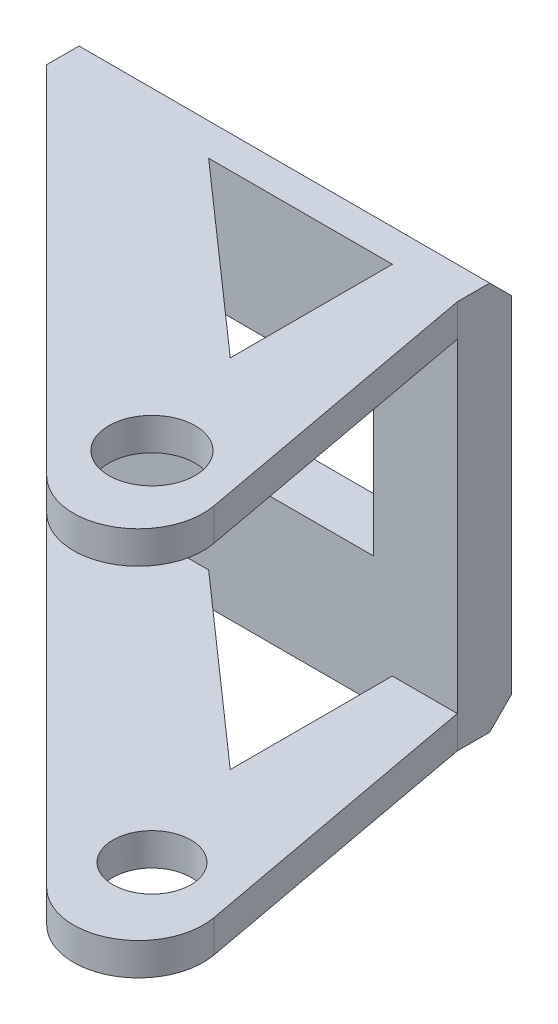
ISO-10303-21;
HEADER;
FILE_DESCRIPTION(('STEP AP214'),'2;1');
FILE_NAME('part.step','',(''),(''),'','','');
FILE_SCHEMA(('AUTOMOTIVE_DESIGN { 1 0 10303 214 1 1 1 1 }'));
ENDSEC;
DATA;
#1=APPLICATION_CONTEXT('core data for automotive mechanical design processes');
#2=APPLICATION_PROTOCOL_DEFINITION('international standard','automotive_design',2000,#1);
#3=PRODUCT_CONTEXT('',#1,'mechanical');
#4=PRODUCT('Part','Part','',(#3));
#5=PRODUCT_RELATED_PRODUCT_CATEGORY('part','',(#4));
#6=PRODUCT_DEFINITION_FORMATION('','',#4);
#7=PRODUCT_DEFINITION_CONTEXT('part definition',#1,'design');
#8=PRODUCT_DEFINITION('design','',#6,#7);
#9=PRODUCT_DEFINITION_SHAPE('','',#8);
#10=(LENGTH_UNIT() NAMED_UNIT(*) SI_UNIT(.MILLI.,.METRE.));
#11=(NAMED_UNIT(*) PLANE_ANGLE_UNIT() SI_UNIT($,.RADIAN.));
#12=(NAMED_UNIT(*) SI_UNIT($,.STERADIAN.) SOLID_ANGLE_UNIT());
#13=UNCERTAINTY_MEASURE_WITH_UNIT(LENGTH_MEASURE(1.E-05),#10,'distance_accuracy_value','');
#14=(GEOMETRIC_REPRESENTATION_CONTEXT(3) GLOBAL_UNCERTAINTY_ASSIGNED_CONTEXT((#13)) GLOBAL_UNIT_ASSIGNED_CONTEXT((#10,
#11,#12)) REPRESENTATION_CONTEXT('',''));
#15=CARTESIAN_POINT('',(0.,0.,0.));
#16=DIRECTION('',(0.,0.,1.));
#17=DIRECTION('',(1.,0.,0.));
#18=AXIS2_PLACEMENT_3D('',#15,#16,#17);
#19=CARTESIAN_POINT('',(-19.,-15.,5.));
#20=DIRECTION('',(0.,0.,-1.));
#21=DIRECTION('',(-1.,0.,0.));
#22=AXIS2_PLACEMENT_3D('',#19,#20,#21);
#23=PLANE('',#22);
#24=DIRECTION('',(0.,-1.,0.));
#25=VECTOR('',#24,1.);
#26=CARTESIAN_POINT('',(-4.0118792883106,23.5,5.));
#27=LINE('',#26,#25);
#28=CARTESIAN_POINT('',(-4.01187928831059,-15.,5.));
#29=VERTEX_POINT('',#28);
#30=CARTESIAN_POINT('',(-4.01187928831059,-18.,5.));
#31=VERTEX_POINT('',#30);
#32=EDGE_CURVE('E106',#29,#31,#27,.T.);
#33=ORIENTED_EDGE('',*,*,#32,.T.);
#34=DIRECTION('',(1.,0.,0.));
#35=VECTOR('',#34,1.);
#36=CARTESIAN_POINT('',(-19.,-18.,5.));
#37=LINE('',#36,#35);
#38=CARTESIAN_POINT('',(-19.,-18.,5.));
#39=VERTEX_POINT('',#38);
#40=EDGE_CURVE('E119',#39,#31,#37,.T.);
#41=ORIENTED_EDGE('',*,*,#40,.F.);
#42=DIRECTION('',(0.,-1.,0.));
#43=VECTOR('',#42,1.);
#44=CARTESIAN_POINT('',(-19.,-15.,5.));
#45=LINE('',#44,#43);
#46=CARTESIAN_POINT('',(-19.,-15.,5.));
#47=VERTEX_POINT('',#46);
#48=EDGE_CURVE('E138',#47,#39,#45,.T.);
#49=ORIENTED_EDGE('',*,*,#48,.F.);
#50=DIRECTION('',(1.,0.,0.));
#51=VECTOR('',#50,1.);
#52=CARTESIAN_POINT('',(-19.,-15.,5.));
#53=LINE('',#52,#51);
#54=EDGE_CURVE('E121',#47,#29,#53,.T.);
#55=ORIENTED_EDGE('',*,*,#54,.T.);
#56=EDGE_LOOP('',(#33,#41,#49,#55));
#57=FACE_BOUND('',#56,.T.);
#58=ADVANCED_FACE('F45',(#57),#23,.T.);
#59=DIRECTION('',(0.,-1.,0.));
#60=VECTOR('',#59,1.);
#61=CARTESIAN_POINT('',(12.9881207116894,23.5,5.));
#62=LINE('',#61,#60);
#63=CARTESIAN_POINT('',(12.9881207116894,-15.,5.));
#64=VERTEX_POINT('',#63);
#65=CARTESIAN_POINT('',(12.9881207116894,-18.,5.));
#66=VERTEX_POINT('',#65);
#67=EDGE_CURVE('E60',#64,#66,#62,.T.);
#68=ORIENTED_EDGE('',*,*,#67,.F.);
#69=CARTESIAN_POINT('',(19.,-15.,5.));
#70=VERTEX_POINT('',#69);
#71=EDGE_CURVE('E137',#64,#70,#53,.T.);
#72=ORIENTED_EDGE('',*,*,#71,.T.);
#73=DIRECTION('',(0.,-1.,0.));
#74=VECTOR('',#73,1.);
#75=CARTESIAN_POINT('',(19.,-15.,5.));
#76=LINE('',#75,#74);
#77=CARTESIAN_POINT('',(19.,-18.,5.));
#78=VERTEX_POINT('',#77);
#79=EDGE_CURVE('E141',#70,#78,#76,.T.);
#80=ORIENTED_EDGE('',*,*,#79,.T.);
#81=EDGE_CURVE('E127',#66,#78,#37,.T.);
#82=ORIENTED_EDGE('',*,*,#81,.F.);
#83=EDGE_LOOP('',(#68,#72,#80,#82));
#84=FACE_BOUND('',#83,.T.);
#85=ADVANCED_FACE('F187',(#84),#23,.T.);
#86=CARTESIAN_POINT('',(-19.,-15.,5.));
#87=DIRECTION('',(-0.707106781186549,0.,0.707106781186546));
#88=DIRECTION('',(0.707106781186546,0.,0.707106781186549));
#89=AXIS2_PLACEMENT_3D('',#86,#87,#88);
#90=PLANE('',#89);
#91=DIRECTION('',(-0.707106781186546,0.,-0.707106781186549));
#92=VECTOR('',#91,1.);
#93=CARTESIAN_POINT('',(-19.,-18.,5.));
#94=LINE('',#93,#92);
#95=CARTESIAN_POINT('',(13.9548612082946,-18.,37.9548612082947));
#96=VERTEX_POINT('',#95);
#97=EDGE_CURVE('E124',#96,#39,#94,.T.);
#98=ORIENTED_EDGE('',*,*,#97,.F.);
#99=DIRECTION('',(0.,-1.,0.));
#100=VECTOR('',#99,1.);
#101=CARTESIAN_POINT('',(13.9548612082946,-15.,37.9548612082947));
#102=LINE('',#101,#100);
#103=CARTESIAN_POINT('',(13.9548612082946,-15.,37.9548612082947));
#104=VERTEX_POINT('',#103);
#105=EDGE_CURVE('E53',#96,#104,#102,.F.);
#106=ORIENTED_EDGE('',*,*,#105,.T.);
#107=DIRECTION('',(-0.707106781186546,0.,-0.707106781186549));
#108=VECTOR('',#107,1.);
#109=CARTESIAN_POINT('',(-19.,-15.,5.));
#110=LINE('',#109,#108);
#111=EDGE_CURVE('E133',#104,#47,#110,.T.);
#112=ORIENTED_EDGE('',*,*,#111,.T.);
#113=ORIENTED_EDGE('',*,*,#48,.T.);
#114=EDGE_LOOP('',(#98,#106,#112,#113));
#115=FACE_BOUND('',#114,.T.);
#116=ADVANCED_FACE('F150',(#115),#90,.T.);
#117=CARTESIAN_POINT('',(27.6,-15.,51.6000000000002));
#118=DIRECTION('',(0.983393770712441,0.,-0.181484687298862));
#119=DIRECTION('',(-0.181484687298862,0.,-0.983393770712442));
#120=AXIS2_PLACEMENT_3D('',#117,#118,#119);
#121=PLANE('',#120);
#122=DIRECTION('',(0.181484687298862,0.,0.983393770712442));
#123=VECTOR('',#122,1.);
#124=CARTESIAN_POINT('',(27.6,-15.,51.6000000000002));
#125=LINE('',#124,#123);
#126=CARTESIAN_POINT('',(24.0978645196885,-15.,32.6233123973823));
#127=VERTEX_POINT('',#126);
#128=EDGE_CURVE('E157',#70,#127,#125,.T.);
#129=ORIENTED_EDGE('',*,*,#128,.T.);
#130=DIRECTION('',(0.,-1.,0.));
#131=VECTOR('',#130,1.);
#132=CARTESIAN_POINT('',(24.0978645196885,-15.,32.6233123973823));
#133=LINE('',#132,#131);
#134=CARTESIAN_POINT('',(24.0978645196885,-18.,32.6233123973823));
#135=VERTEX_POINT('',#134);
#136=EDGE_CURVE('E140',#127,#135,#133,.T.);
#137=ORIENTED_EDGE('',*,*,#136,.T.);
#138=DIRECTION('',(0.181484687298862,0.,0.983393770712442));
#139=VECTOR('',#138,1.);
#140=CARTESIAN_POINT('',(27.6,-18.,51.6000000000002));
#141=LINE('',#140,#139);
#142=EDGE_CURVE('E126',#78,#135,#141,.T.);
#143=ORIENTED_EDGE('',*,*,#142,.F.);
#144=ORIENTED_EDGE('',*,*,#79,.F.);
#145=EDGE_LOOP('',(#129,#137,#143,#144));
#146=FACE_BOUND('',#145,.T.);
#147=ADVANCED_FACE('F160',(#146),#121,.T.);
#148=CARTESIAN_POINT('',(0.,-15.,0.));
#149=DIRECTION('',(0.,1.,0.));
#150=DIRECTION('',(-1.,0.,0.));
#151=AXIS2_PLACEMENT_3D('',#148,#149,#150);
#152=PLANE('',#151);
#153=CARTESIAN_POINT('',(16.8016720628396,-15.,31.0567245075283));
#154=DIRECTION('',(0.,1.,0.));
#155=DIRECTION('',(-1.,0.,0.));
#156=AXIS2_PLACEMENT_3D('',#153,#154,#155);
#157=CIRCLE('',#156,3.6);
#158=CARTESIAN_POINT('',(13.2016720628397,-15.,31.0567245075283));
#159=VERTEX_POINT('',#158);
#160=EDGE_CURVE('E113',#159,#159,#157,.T.);
#161=ORIENTED_EDGE('',*,*,#160,.F.);
#162=EDGE_LOOP('',(#161));
#163=FACE_BOUND('',#162,.T.);
#164=DIRECTION('',(0.749837855365093,0.,0.661621637086846));
#165=VECTOR('',#164,1.);
#166=CARTESIAN_POINT('',(-4.23671758729549,-15.,4.80161326560156));
#167=LINE('',#166,#165);
#168=CARTESIAN_POINT('',(12.9881207116894,-15.,20.));
#169=VERTEX_POINT('',#168);
#170=EDGE_CURVE('E131',#29,#169,#167,.T.);
#171=ORIENTED_EDGE('',*,*,#170,.F.);
#172=ORIENTED_EDGE('',*,*,#54,.F.);
#173=ORIENTED_EDGE('',*,*,#111,.F.);
#174=CARTESIAN_POINT('',(18.1975018954139,-15.,33.7122205211755));
#175=DIRECTION('',(0.,1.,0.));
#176=DIRECTION('',(-1.,0.,0.));
#177=AXIS2_PLACEMENT_3D('',#174,#175,#176);
#178=CIRCLE('',#177,6.);
#179=EDGE_CURVE('E12',#104,#127,#178,.T.);
#180=ORIENTED_EDGE('',*,*,#179,.T.);
#181=ORIENTED_EDGE('',*,*,#128,.F.);
#182=ORIENTED_EDGE('',*,*,#71,.F.);
#183=DIRECTION('',(0.,0.,-1.));
#184=VECTOR('',#183,1.);
#185=CARTESIAN_POINT('',(12.9881207116894,-15.,0.));
#186=LINE('',#185,#184);
#187=EDGE_CURVE('E164',#169,#64,#186,.T.);
#188=ORIENTED_EDGE('',*,*,#187,.F.);
#189=EDGE_LOOP('',(#171,#172,#173,#180,#181,#182,#188));
#190=FACE_BOUND('',#189,.T.);
#191=ADVANCED_FACE('F155',(#163,#190),#152,.T.);
#192=CARTESIAN_POINT('',(0.,-18.,0.));
#193=DIRECTION('',(0.,1.,0.));
#194=DIRECTION('',(-1.,0.,0.));
#195=AXIS2_PLACEMENT_3D('',#192,#193,#194);
#196=PLANE('',#195);
#197=CARTESIAN_POINT('',(16.8016720628397,-18.,31.0567245075283));
#198=DIRECTION('',(0.,-1.,0.));
#199=DIRECTION('',(1.,0.,0.));
#200=AXIS2_PLACEMENT_3D('',#197,#198,#199);
#201=CIRCLE('',#200,3.6);
#202=CARTESIAN_POINT('',(20.4016720628397,-18.,31.0567245075283));
#203=VERTEX_POINT('',#202);
#204=EDGE_CURVE('E171',#203,#203,#201,.T.);
#205=ORIENTED_EDGE('',*,*,#204,.F.);
#206=EDGE_LOOP('',(#205));
#207=FACE_BOUND('',#206,.T.);
#208=ORIENTED_EDGE('',*,*,#40,.T.);
#209=DIRECTION('',(-0.749837855365093,0.,-0.661621637086846));
#210=VECTOR('',#209,1.);
#211=CARTESIAN_POINT('',(12.9881207116894,-18.,20.));
#212=LINE('',#211,#210);
#213=CARTESIAN_POINT('',(12.9881207116894,-18.,20.));
#214=VERTEX_POINT('',#213);
#215=EDGE_CURVE('E103',#214,#31,#212,.T.);
#216=ORIENTED_EDGE('',*,*,#215,.F.);
#217=DIRECTION('',(0.,0.,1.));
#218=VECTOR('',#217,1.);
#219=CARTESIAN_POINT('',(12.9881207116894,-18.,5.));
#220=LINE('',#219,#218);
#221=EDGE_CURVE('E112',#66,#214,#220,.T.);
#222=ORIENTED_EDGE('',*,*,#221,.F.);
#223=ORIENTED_EDGE('',*,*,#81,.T.);
#224=ORIENTED_EDGE('',*,*,#142,.T.);
#225=CARTESIAN_POINT('',(18.1975018954139,-18.,33.7122205211755));
#226=DIRECTION('',(0.,1.,0.));
#227=DIRECTION('',(-1.,0.,0.));
#228=AXIS2_PLACEMENT_3D('',#225,#226,#227);
#229=CIRCLE('',#228,6.);
#230=EDGE_CURVE('E146',#135,#96,#229,.F.);
#231=ORIENTED_EDGE('',*,*,#230,.T.);
#232=ORIENTED_EDGE('',*,*,#97,.T.);
#233=EDGE_LOOP('',(#208,#216,#222,#223,#224,#231,#232));
#234=FACE_BOUND('',#233,.T.);
#235=ADVANCED_FACE('F123',(#207,#234),#196,.F.);
#236=CARTESIAN_POINT('',(18.1975018954139,-15.,33.7122205211755));
#237=DIRECTION('',(0.,-1.,0.));
#238=DIRECTION('',(1.,0.,0.));
#239=AXIS2_PLACEMENT_3D('',#236,#237,#238);
#240=CYLINDRICAL_SURFACE('',#239,6.);
#241=ORIENTED_EDGE('',*,*,#179,.F.);
#242=ORIENTED_EDGE('',*,*,#105,.F.);
#243=ORIENTED_EDGE('',*,*,#230,.F.);
#244=ORIENTED_EDGE('',*,*,#136,.F.);
#245=EDGE_LOOP('',(#241,#242,#243,#244));
#246=FACE_BOUND('',#245,.T.);
#247=ADVANCED_FACE('F47',(#246),#240,.T.);
#248=CARTESIAN_POINT('',(12.9881207116894,23.5,20.));
#249=DIRECTION('',(-0.661621637086846,0.,0.749837855365093));
#250=DIRECTION('',(0.749837855365093,0.,0.661621637086846));
#251=AXIS2_PLACEMENT_3D('',#248,#249,#250);
#252=PLANE('',#251);
#253=ORIENTED_EDGE('',*,*,#170,.T.);
#254=DIRECTION('',(0.,-1.,0.));
#255=VECTOR('',#254,1.);
#256=CARTESIAN_POINT('',(12.9881207116894,23.5,20.));
#257=LINE('',#256,#255);
#258=EDGE_CURVE('E109',#169,#214,#257,.T.);
#259=ORIENTED_EDGE('',*,*,#258,.T.);
#260=ORIENTED_EDGE('',*,*,#215,.T.);
#261=ORIENTED_EDGE('',*,*,#32,.F.);
#262=EDGE_LOOP('',(#253,#259,#260,#261));
#263=FACE_BOUND('',#262,.T.);
#264=ADVANCED_FACE('F105',(#263),#252,.F.);
#265=CARTESIAN_POINT('',(12.9881207116894,23.5,5.));
#266=DIRECTION('',(1.,0.,0.));
#267=DIRECTION('',(0.,1.,0.));
#268=AXIS2_PLACEMENT_3D('',#265,#266,#267);
#269=PLANE('',#268);
#270=ORIENTED_EDGE('',*,*,#187,.T.);
#271=ORIENTED_EDGE('',*,*,#67,.T.);
#272=ORIENTED_EDGE('',*,*,#221,.T.);
#273=ORIENTED_EDGE('',*,*,#258,.F.);
#274=EDGE_LOOP('',(#270,#271,#272,#273));
#275=FACE_BOUND('',#274,.T.);
#276=ADVANCED_FACE('F214',(#275),#269,.F.);
#277=CARTESIAN_POINT('',(16.8016720628396,-7.99999999999999,31.0567245075283));
#278=DIRECTION('',(0.,-1.,0.));
#279=DIRECTION('',(1.,0.,0.));
#280=AXIS2_PLACEMENT_3D('',#277,#278,#279);
#281=CYLINDRICAL_SURFACE('',#280,3.6);
#282=ORIENTED_EDGE('',*,*,#160,.T.);
#283=EDGE_LOOP('',(#282));
#284=FACE_BOUND('',#283,.T.);
#285=ORIENTED_EDGE('',*,*,#204,.T.);
#286=EDGE_LOOP('',(#285));
#287=FACE_BOUND('',#286,.T.);
#288=ADVANCED_FACE('F175',(#284,#287),#281,.F.);
#289=CLOSED_SHELL('',(#58,#85,#116,#147,#191,#235,#247,#264,#276,#288));
#290=MANIFOLD_SOLID_BREP('B2',#289);
#291=CARTESIAN_POINT('',(11.25,-6.25,5.));
#292=DIRECTION('',(-1.,0.,0.));
#293=DIRECTION('',(0.,0.,1.));
#294=AXIS2_PLACEMENT_3D('',#291,#292,#293);
#295=PLANE('',#294);
#296=DIRECTION('',(0.,0.,-1.));
#297=VECTOR('',#296,1.);
#298=CARTESIAN_POINT('',(11.25,6.25,5.));
#299=LINE('',#298,#297);
#300=CARTESIAN_POINT('',(11.25,6.25,5.));
#301=VERTEX_POINT('',#300);
#302=CARTESIAN_POINT('',(11.25,6.25,1.5));
#303=VERTEX_POINT('',#302);
#304=EDGE_CURVE('E517',#301,#303,#299,.T.);
#305=ORIENTED_EDGE('',*,*,#304,.T.);
#306=DIRECTION('',(0.,-1.,0.));
#307=VECTOR('',#306,1.);
#308=CARTESIAN_POINT('',(11.25,-6.25,1.5));
#309=LINE('',#308,#307);
#310=CARTESIAN_POINT('',(11.25,-6.25,1.5));
#311=VERTEX_POINT('',#310);
#312=EDGE_CURVE('E466',#303,#311,#309,.T.);
#313=ORIENTED_EDGE('',*,*,#312,.T.);
#314=DIRECTION('',(0.,0.,-1.));
#315=VECTOR('',#314,1.);
#316=CARTESIAN_POINT('',(11.25,-6.25,5.));
#317=LINE('',#316,#315);
#318=CARTESIAN_POINT('',(11.25,-6.25,5.));
#319=VERTEX_POINT('',#318);
#320=EDGE_CURVE('E506',#319,#311,#317,.T.);
#321=ORIENTED_EDGE('',*,*,#320,.F.);
#322=DIRECTION('',(0.,1.,0.));
#323=VECTOR('',#322,1.);
#324=CARTESIAN_POINT('',(11.25,-6.25,5.));
#325=LINE('',#324,#323);
#326=EDGE_CURVE('E496',#319,#301,#325,.T.);
#327=ORIENTED_EDGE('',*,*,#326,.T.);
#328=EDGE_LOOP('',(#305,#313,#321,#327));
#329=FACE_BOUND('',#328,.T.);
#330=ADVANCED_FACE('F265',(#329),#295,.T.);
#331=CARTESIAN_POINT('',(-11.25,-6.25,5.));
#332=DIRECTION('',(1.,0.,0.));
#333=DIRECTION('',(0.,0.,-1.));
#334=AXIS2_PLACEMENT_3D('',#331,#332,#333);
#335=PLANE('',#334);
#336=DIRECTION('',(0.,0.,-1.));
#337=VECTOR('',#336,1.);
#338=CARTESIAN_POINT('',(-11.25,-6.25,5.));
#339=LINE('',#338,#337);
#340=CARTESIAN_POINT('',(-11.25,-6.25,5.));
#341=VERTEX_POINT('',#340);
#342=CARTESIAN_POINT('',(-11.25,-6.25,1.5));
#343=VERTEX_POINT('',#342);
#344=EDGE_CURVE('E511',#341,#343,#339,.T.);
#345=ORIENTED_EDGE('',*,*,#344,.T.);
#346=DIRECTION('',(0.,1.,0.));
#347=VECTOR('',#346,1.);
#348=CARTESIAN_POINT('',(-11.25,-6.25,1.5));
#349=LINE('',#348,#347);
#350=CARTESIAN_POINT('',(-11.25,6.25,1.5));
#351=VERTEX_POINT('',#350);
#352=EDGE_CURVE('E455',#343,#351,#349,.T.);
#353=ORIENTED_EDGE('',*,*,#352,.T.);
#354=DIRECTION('',(0.,0.,-1.));
#355=VECTOR('',#354,1.);
#356=CARTESIAN_POINT('',(-11.25,6.25,5.));
#357=LINE('',#356,#355);
#358=CARTESIAN_POINT('',(-11.25,6.25,5.));
#359=VERTEX_POINT('',#358);
#360=EDGE_CURVE('E514',#359,#351,#357,.T.);
#361=ORIENTED_EDGE('',*,*,#360,.F.);
#362=DIRECTION('',(0.,-1.,0.));
#363=VECTOR('',#362,1.);
#364=CARTESIAN_POINT('',(-11.25,-6.25,5.));
#365=LINE('',#364,#363);
#366=EDGE_CURVE('E501',#359,#341,#365,.T.);
#367=ORIENTED_EDGE('',*,*,#366,.T.);
#368=EDGE_LOOP('',(#345,#353,#361,#367));
#369=FACE_BOUND('',#368,.T.);
#370=ADVANCED_FACE('F626',(#369),#335,.T.);
#371=CARTESIAN_POINT('',(0.,0.,5.));
#372=DIRECTION('',(0.,0.,1.));
#373=DIRECTION('',(1.,0.,0.));
#374=AXIS2_PLACEMENT_3D('',#371,#372,#373);
#375=PLANE('',#374);
#376=ORIENTED_EDGE('',*,*,#366,.F.);
#377=DIRECTION('',(-1.,0.,0.));
#378=VECTOR('',#377,1.);
#379=CARTESIAN_POINT('',(-11.25,6.25,5.));
#380=LINE('',#379,#378);
#381=EDGE_CURVE('E498',#301,#359,#380,.T.);
#382=ORIENTED_EDGE('',*,*,#381,.F.);
#383=ORIENTED_EDGE('',*,*,#326,.F.);
#384=DIRECTION('',(1.,0.,0.));
#385=VECTOR('',#384,1.);
#386=CARTESIAN_POINT('',(-11.25,-6.25,5.));
#387=LINE('',#386,#385);
#388=EDGE_CURVE('E504',#341,#319,#387,.T.);
#389=ORIENTED_EDGE('',*,*,#388,.F.);
#390=EDGE_LOOP('',(#376,#382,#383,#389));
#391=FACE_BOUND('',#390,.T.);
#392=DIRECTION('',(-1.,0.,0.));
#393=VECTOR('',#392,1.);
#394=CARTESIAN_POINT('',(-19.,15.,5.));
#395=LINE('',#394,#393);
#396=CARTESIAN_POINT('',(19.,15.,5.));
#397=VERTEX_POINT('',#396);
#398=CARTESIAN_POINT('',(12.9881207116894,15.,5.));
#399=VERTEX_POINT('',#398);
#400=EDGE_CURVE('E480',#397,#399,#395,.T.);
#401=ORIENTED_EDGE('',*,*,#400,.T.);
#402=DIRECTION('',(0.,-1.,0.));
#403=VECTOR('',#402,1.);
#404=CARTESIAN_POINT('',(12.9881207116894,23.5,5.));
#405=LINE('',#404,#403);
#406=CARTESIAN_POINT('',(12.9881207116894,18.,5.));
#407=VERTEX_POINT('',#406);
#408=EDGE_CURVE('E411',#407,#399,#405,.T.);
#409=ORIENTED_EDGE('',*,*,#408,.F.);
#410=DIRECTION('',(1.,0.,0.));
#411=VECTOR('',#410,1.);
#412=CARTESIAN_POINT('',(19.,18.,5.));
#413=LINE('',#412,#411);
#414=CARTESIAN_POINT('',(-4.0118792883106,18.,5.));
#415=VERTEX_POINT('',#414);
#416=EDGE_CURVE('E405',#415,#407,#413,.T.);
#417=ORIENTED_EDGE('',*,*,#416,.F.);
#418=DIRECTION('',(0.,-1.,0.));
#419=VECTOR('',#418,1.);
#420=CARTESIAN_POINT('',(-4.0118792883106,23.5,5.));
#421=LINE('',#420,#419);
#422=CARTESIAN_POINT('',(-4.0118792883106,15.,5.));
#423=VERTEX_POINT('',#422);
#424=EDGE_CURVE('E409',#415,#423,#421,.T.);
#425=ORIENTED_EDGE('',*,*,#424,.T.);
#426=CARTESIAN_POINT('',(-19.,15.,5.));
#427=VERTEX_POINT('',#426);
#428=EDGE_CURVE('E479',#423,#427,#395,.T.);
#429=ORIENTED_EDGE('',*,*,#428,.T.);
#430=DIRECTION('',(0.,-1.,0.));
#431=VECTOR('',#430,1.);
#432=CARTESIAN_POINT('',(-19.,-18.,5.));
#433=LINE('',#432,#431);
#434=CARTESIAN_POINT('',(-19.,-18.,5.));
#435=VERTEX_POINT('',#434);
#436=EDGE_CURVE('E525',#427,#435,#433,.T.);
#437=ORIENTED_EDGE('',*,*,#436,.T.);
#438=DIRECTION('',(1.,0.,0.));
#439=VECTOR('',#438,1.);
#440=CARTESIAN_POINT('',(19.,-18.,5.));
#441=LINE('',#440,#439);
#442=CARTESIAN_POINT('',(19.,-18.,5.));
#443=VERTEX_POINT('',#442);
#444=EDGE_CURVE('E524',#435,#443,#441,.T.);
#445=ORIENTED_EDGE('',*,*,#444,.T.);
#446=DIRECTION('',(0.,1.,0.));
#447=VECTOR('',#446,1.);
#448=CARTESIAN_POINT('',(19.,-18.,5.));
#449=LINE('',#448,#447);
#450=EDGE_CURVE('E527',#443,#397,#449,.T.);
#451=ORIENTED_EDGE('',*,*,#450,.T.);
#452=EDGE_LOOP('',(#401,#409,#417,#425,#429,#437,#445,#451));
#453=FACE_BOUND('',#452,.T.);
#454=ADVANCED_FACE('F408',(#391,#453),#375,.T.);
#455=CARTESIAN_POINT('',(0.,0.,0.));
#456=DIRECTION('',(0.,0.,1.));
#457=DIRECTION('',(1.,0.,0.));
#458=AXIS2_PLACEMENT_3D('',#455,#456,#457);
#459=PLANE('',#458);
#460=DIRECTION('',(0.,-1.,0.));
#461=VECTOR('',#460,1.);
#462=CARTESIAN_POINT('',(-19.,-18.,0.));
#463=LINE('',#462,#461);
#464=CARTESIAN_POINT('',(-19.,16.,0.));
#465=VERTEX_POINT('',#464);
#466=CARTESIAN_POINT('',(-19.,-16.,0.));
#467=VERTEX_POINT('',#466);
#468=EDGE_CURVE('E520',#465,#467,#463,.T.);
#469=ORIENTED_EDGE('',*,*,#468,.F.);
#470=DIRECTION('',(1.,0.,0.));
#471=VECTOR('',#470,1.);
#472=CARTESIAN_POINT('',(0.,16.,0.));
#473=LINE('',#472,#471);
#474=CARTESIAN_POINT('',(19.,16.,0.));
#475=VERTEX_POINT('',#474);
#476=EDGE_CURVE('E289',#465,#475,#473,.T.);
#477=ORIENTED_EDGE('',*,*,#476,.T.);
#478=DIRECTION('',(0.,1.,0.));
#479=VECTOR('',#478,1.);
#480=CARTESIAN_POINT('',(19.,-18.,0.));
#481=LINE('',#480,#479);
#482=CARTESIAN_POINT('',(19.,-16.,0.));
#483=VERTEX_POINT('',#482);
#484=EDGE_CURVE('E533',#483,#475,#481,.T.);
#485=ORIENTED_EDGE('',*,*,#484,.F.);
#486=DIRECTION('',(-1.,0.,0.));
#487=VECTOR('',#486,1.);
#488=CARTESIAN_POINT('',(0.,-16.,0.));
#489=LINE('',#488,#487);
#490=EDGE_CURVE('E556',#483,#467,#489,.T.);
#491=ORIENTED_EDGE('',*,*,#490,.T.);
#492=EDGE_LOOP('',(#469,#477,#485,#491));
#493=FACE_BOUND('',#492,.T.);
#494=DIRECTION('',(-1.,0.,0.));
#495=VECTOR('',#494,1.);
#496=CARTESIAN_POINT('',(-11.25,6.25,0.));
#497=LINE('',#496,#495);
#498=CARTESIAN_POINT('',(16.25,6.25,0.));
#499=VERTEX_POINT('',#498);
#500=CARTESIAN_POINT('',(-16.25,6.25,0.));
#501=VERTEX_POINT('',#500);
#502=EDGE_CURVE('E492',#499,#501,#497,.T.);
#503=ORIENTED_EDGE('',*,*,#502,.T.);
#504=DIRECTION('',(0.,1.,0.));
#505=VECTOR('',#504,1.);
#506=CARTESIAN_POINT('',(-16.25,-6.25,0.));
#507=LINE('',#506,#505);
#508=CARTESIAN_POINT('',(-16.25,-6.25,0.));
#509=VERTEX_POINT('',#508);
#510=EDGE_CURVE('E433',#509,#501,#507,.T.);
#511=ORIENTED_EDGE('',*,*,#510,.F.);
#512=DIRECTION('',(1.,0.,0.));
#513=VECTOR('',#512,1.);
#514=CARTESIAN_POINT('',(-11.25,-6.25,0.));
#515=LINE('',#514,#513);
#516=CARTESIAN_POINT('',(16.25,-6.25,0.));
#517=VERTEX_POINT('',#516);
#518=EDGE_CURVE('E499',#509,#517,#515,.T.);
#519=ORIENTED_EDGE('',*,*,#518,.T.);
#520=DIRECTION('',(0.,-1.,0.));
#521=VECTOR('',#520,1.);
#522=CARTESIAN_POINT('',(16.25,-6.25,0.));
#523=LINE('',#522,#521);
#524=EDGE_CURVE('E430',#499,#517,#523,.T.);
#525=ORIENTED_EDGE('',*,*,#524,.F.);
#526=EDGE_LOOP('',(#503,#511,#519,#525));
#527=FACE_BOUND('',#526,.T.);
#528=ADVANCED_FACE('F574',(#493,#527),#459,.F.);
#529=CARTESIAN_POINT('',(-19.,-18.,5.));
#530=DIRECTION('',(1.,0.,0.));
#531=DIRECTION('',(0.,0.,-1.));
#532=AXIS2_PLACEMENT_3D('',#529,#530,#531);
#533=PLANE('',#532);
#534=DIRECTION('',(0.,0.,-1.));
#535=VECTOR('',#534,1.);
#536=CARTESIAN_POINT('',(-19.,18.,5.));
#537=LINE('',#536,#535);
#538=CARTESIAN_POINT('',(-19.,18.,5.));
#539=VERTEX_POINT('',#538);
#540=CARTESIAN_POINT('',(-19.,18.,1.99999999999999));
#541=VERTEX_POINT('',#540);
#542=EDGE_CURVE('E530',#539,#541,#537,.T.);
#543=ORIENTED_EDGE('',*,*,#542,.T.);
#544=DIRECTION('',(0.,0.70710678118655,0.707106781186545));
#545=VECTOR('',#544,1.);
#546=CARTESIAN_POINT('',(-19.,18.,2.));
#547=LINE('',#546,#545);
#548=EDGE_CURVE('E554',#541,#465,#547,.F.);
#549=ORIENTED_EDGE('',*,*,#548,.T.);
#550=ORIENTED_EDGE('',*,*,#468,.T.);
#551=DIRECTION('',(0.,0.70710678118655,-0.707106781186545));
#552=VECTOR('',#551,1.);
#553=CARTESIAN_POINT('',(-19.,-18.,1.99999999999999));
#554=LINE('',#553,#552);
#555=CARTESIAN_POINT('',(-19.,-18.,1.99999999999999));
#556=VERTEX_POINT('',#555);
#557=EDGE_CURVE('E552',#467,#556,#554,.F.);
#558=ORIENTED_EDGE('',*,*,#557,.T.);
#559=DIRECTION('',(0.,0.,-1.));
#560=VECTOR('',#559,1.);
#561=CARTESIAN_POINT('',(-19.,-18.,5.));
#562=LINE('',#561,#560);
#563=EDGE_CURVE('E543',#435,#556,#562,.T.);
#564=ORIENTED_EDGE('',*,*,#563,.F.);
#565=ORIENTED_EDGE('',*,*,#436,.F.);
#566=EDGE_CURVE('E521',#539,#427,#433,.T.);
#567=ORIENTED_EDGE('',*,*,#566,.F.);
#568=EDGE_LOOP('',(#543,#549,#550,#558,#564,#565,#567));
#569=FACE_BOUND('',#568,.T.);
#570=ADVANCED_FACE('F571',(#569),#533,.F.);
#571=CARTESIAN_POINT('',(19.,-18.,5.));
#572=DIRECTION('',(0.,1.,0.));
#573=DIRECTION('',(-1.,0.,0.));
#574=AXIS2_PLACEMENT_3D('',#571,#572,#573);
#575=PLANE('',#574);
#576=ORIENTED_EDGE('',*,*,#563,.T.);
#577=DIRECTION('',(1.,0.,0.));
#578=VECTOR('',#577,1.);
#579=CARTESIAN_POINT('',(19.,-18.,1.99999999999999));
#580=LINE('',#579,#578);
#581=CARTESIAN_POINT('',(19.,-18.,1.99999999999999));
#582=VERTEX_POINT('',#581);
#583=EDGE_CURVE('E43',#556,#582,#580,.T.);
#584=ORIENTED_EDGE('',*,*,#583,.T.);
#585=DIRECTION('',(0.,0.,-1.));
#586=VECTOR('',#585,1.);
#587=CARTESIAN_POINT('',(19.,-18.,5.));
#588=LINE('',#587,#586);
#589=EDGE_CURVE('E540',#443,#582,#588,.T.);
#590=ORIENTED_EDGE('',*,*,#589,.F.);
#591=ORIENTED_EDGE('',*,*,#444,.F.);
#592=EDGE_LOOP('',(#576,#584,#590,#591));
#593=FACE_BOUND('',#592,.T.);
#594=ADVANCED_FACE('F580',(#593),#575,.F.);
#595=CARTESIAN_POINT('',(19.,-18.,5.));
#596=DIRECTION('',(-1.,0.,0.));
#597=DIRECTION('',(0.,0.,1.));
#598=AXIS2_PLACEMENT_3D('',#595,#596,#597);
#599=PLANE('',#598);
#600=ORIENTED_EDGE('',*,*,#484,.T.);
#601=DIRECTION('',(0.,-0.70710678118655,-0.707106781186545));
#602=VECTOR('',#601,1.);
#603=CARTESIAN_POINT('',(19.,18.,1.99999999999999));
#604=LINE('',#603,#602);
#605=CARTESIAN_POINT('',(19.,18.,1.99999999999999));
#606=VERTEX_POINT('',#605);
#607=EDGE_CURVE('E275',#475,#606,#604,.F.);
#608=ORIENTED_EDGE('',*,*,#607,.T.);
#609=DIRECTION('',(0.,0.,-1.));
#610=VECTOR('',#609,1.);
#611=CARTESIAN_POINT('',(19.,18.,5.));
#612=LINE('',#611,#610);
#613=CARTESIAN_POINT('',(19.,18.,5.));
#614=VERTEX_POINT('',#613);
#615=EDGE_CURVE('E537',#614,#606,#612,.T.);
#616=ORIENTED_EDGE('',*,*,#615,.F.);
#617=DIRECTION('',(0.,1.,0.));
#618=VECTOR('',#617,1.);
#619=CARTESIAN_POINT('',(19.,15.,5.));
#620=LINE('',#619,#618);
#621=EDGE_CURVE('E490',#397,#614,#620,.T.);
#622=ORIENTED_EDGE('',*,*,#621,.F.);
#623=ORIENTED_EDGE('',*,*,#450,.F.);
#624=ORIENTED_EDGE('',*,*,#589,.T.);
#625=DIRECTION('',(0.,-0.70710678118655,0.707106781186545));
#626=VECTOR('',#625,1.);
#627=CARTESIAN_POINT('',(19.,-18.,1.99999999999999));
#628=LINE('',#627,#626);
#629=EDGE_CURVE('E282',#582,#483,#628,.F.);
#630=ORIENTED_EDGE('',*,*,#629,.T.);
#631=EDGE_LOOP('',(#600,#608,#616,#622,#623,#624,#630));
#632=FACE_BOUND('',#631,.T.);
#633=ADVANCED_FACE('F563',(#632),#599,.F.);
#634=CARTESIAN_POINT('',(19.,18.,5.));
#635=DIRECTION('',(0.,-1.,0.));
#636=DIRECTION('',(1.,0.,0.));
#637=AXIS2_PLACEMENT_3D('',#634,#635,#636);
#638=PLANE('',#637);
#639=CARTESIAN_POINT('',(16.8016720628389,18.,31.0567245075284));
#640=DIRECTION('',(0.,1.,0.));
#641=DIRECTION('',(-1.,0.,0.));
#642=AXIS2_PLACEMENT_3D('',#639,#640,#641);
#643=CIRCLE('',#642,4.);
#644=CARTESIAN_POINT('',(12.8016720628389,18.,31.0567245075284));
#645=VERTEX_POINT('',#644);
#646=EDGE_CURVE('E602',#645,#645,#643,.T.);
#647=ORIENTED_EDGE('',*,*,#646,.F.);
#648=EDGE_LOOP('',(#647));
#649=FACE_BOUND('',#648,.T.);
#650=DIRECTION('',(0.,0.,1.));
#651=VECTOR('',#650,1.);
#652=CARTESIAN_POINT('',(12.9881207116894,18.,5.));
#653=LINE('',#652,#651);
#654=CARTESIAN_POINT('',(12.9881207116894,18.,20.));
#655=VERTEX_POINT('',#654);
#656=EDGE_CURVE('E416',#407,#655,#653,.T.);
#657=ORIENTED_EDGE('',*,*,#656,.T.);
#658=DIRECTION('',(-0.749837855365093,0.,-0.661621637086846));
#659=VECTOR('',#658,1.);
#660=CARTESIAN_POINT('',(8.92670653721812,18.,16.4163992578195));
#661=LINE('',#660,#659);
#662=EDGE_CURVE('E422',#655,#415,#661,.T.);
#663=ORIENTED_EDGE('',*,*,#662,.T.);
#664=ORIENTED_EDGE('',*,*,#416,.T.);
#665=EDGE_LOOP('',(#657,#663,#664));
#666=FACE_BOUND('',#665,.T.);
#667=ORIENTED_EDGE('',*,*,#615,.T.);
#668=DIRECTION('',(-1.,0.,0.));
#669=VECTOR('',#668,1.);
#670=CARTESIAN_POINT('',(19.,18.,1.99999999999999));
#671=LINE('',#670,#669);
#672=EDGE_CURVE('E549',#606,#541,#671,.T.);
#673=ORIENTED_EDGE('',*,*,#672,.T.);
#674=ORIENTED_EDGE('',*,*,#542,.F.);
#675=DIRECTION('',(0.707106781186546,0.,0.707106781186549));
#676=VECTOR('',#675,1.);
#677=CARTESIAN_POINT('',(-19.,18.,5.));
#678=LINE('',#677,#676);
#679=CARTESIAN_POINT('',(13.9548612082946,18.,37.9548612082947));
#680=VERTEX_POINT('',#679);
#681=EDGE_CURVE('E469',#539,#680,#678,.T.);
#682=ORIENTED_EDGE('',*,*,#681,.T.);
#683=CARTESIAN_POINT('',(18.1975018954139,18.,33.7122205211755));
#684=DIRECTION('',(0.,1.,0.));
#685=DIRECTION('',(1.,0.,0.));
#686=AXIS2_PLACEMENT_3D('',#683,#684,#685);
#687=CIRCLE('',#686,6.00000000000001);
#688=CARTESIAN_POINT('',(24.0978645196885,18.,32.6233123973823));
#689=VERTEX_POINT('',#688);
#690=EDGE_CURVE('E485',#680,#689,#687,.T.);
#691=ORIENTED_EDGE('',*,*,#690,.T.);
#692=DIRECTION('',(-0.181484687298862,0.,-0.983393770712441));
#693=VECTOR('',#692,1.);
#694=CARTESIAN_POINT('',(19.,18.,5.));
#695=LINE('',#694,#693);
#696=EDGE_CURVE('E474',#689,#614,#695,.T.);
#697=ORIENTED_EDGE('',*,*,#696,.T.);
#698=EDGE_LOOP('',(#667,#673,#674,#682,#691,#697));
#699=FACE_BOUND('',#698,.T.);
#700=ADVANCED_FACE('F428',(#649,#666,#699),#638,.F.);
#701=CARTESIAN_POINT('',(-11.25,6.25,5.));
#702=DIRECTION('',(0.,-1.,0.));
#703=DIRECTION('',(0.,0.,-1.));
#704=AXIS2_PLACEMENT_3D('',#701,#702,#703);
#705=PLANE('',#704);
#706=ORIENTED_EDGE('',*,*,#502,.F.);
#707=DIRECTION('',(0.,0.,-1.));
#708=VECTOR('',#707,1.);
#709=CARTESIAN_POINT('',(16.25,6.25,1.5));
#710=LINE('',#709,#708);
#711=CARTESIAN_POINT('',(16.25,6.25,1.5));
#712=VERTEX_POINT('',#711);
#713=EDGE_CURVE('E452',#712,#499,#710,.T.);
#714=ORIENTED_EDGE('',*,*,#713,.F.);
#715=DIRECTION('',(1.,0.,0.));
#716=VECTOR('',#715,1.);
#717=CARTESIAN_POINT('',(-16.25,6.25,1.5));
#718=LINE('',#717,#716);
#719=EDGE_CURVE('E446',#303,#712,#718,.T.);
#720=ORIENTED_EDGE('',*,*,#719,.F.);
#721=ORIENTED_EDGE('',*,*,#304,.F.);
#722=ORIENTED_EDGE('',*,*,#381,.T.);
#723=ORIENTED_EDGE('',*,*,#360,.T.);
#724=CARTESIAN_POINT('',(-16.25,6.25,1.5));
#725=VERTEX_POINT('',#724);
#726=EDGE_CURVE('E447',#725,#351,#718,.T.);
#727=ORIENTED_EDGE('',*,*,#726,.F.);
#728=DIRECTION('',(0.,0.,-1.));
#729=VECTOR('',#728,1.);
#730=CARTESIAN_POINT('',(-16.25,6.25,1.5));
#731=LINE('',#730,#729);
#732=EDGE_CURVE('E456',#725,#501,#731,.T.);
#733=ORIENTED_EDGE('',*,*,#732,.T.);
#734=EDGE_LOOP('',(#706,#714,#720,#721,#722,#723,#727,#733));
#735=FACE_BOUND('',#734,.T.);
#736=ADVANCED_FACE('F636',(#735),#705,.T.);
#737=CARTESIAN_POINT('',(-11.25,-6.25,5.));
#738=DIRECTION('',(0.,1.,0.));
#739=DIRECTION('',(0.,0.,1.));
#740=AXIS2_PLACEMENT_3D('',#737,#738,#739);
#741=PLANE('',#740);
#742=ORIENTED_EDGE('',*,*,#518,.F.);
#743=DIRECTION('',(0.,0.,-1.));
#744=VECTOR('',#743,1.);
#745=CARTESIAN_POINT('',(-16.25,-6.25,1.5));
#746=LINE('',#745,#744);
#747=CARTESIAN_POINT('',(-16.25,-6.25,1.5));
#748=VERTEX_POINT('',#747);
#749=EDGE_CURVE('E459',#748,#509,#746,.T.);
#750=ORIENTED_EDGE('',*,*,#749,.F.);
#751=DIRECTION('',(-1.,0.,0.));
#752=VECTOR('',#751,1.);
#753=CARTESIAN_POINT('',(-16.25,-6.25,1.5));
#754=LINE('',#753,#752);
#755=EDGE_CURVE('E440',#343,#748,#754,.T.);
#756=ORIENTED_EDGE('',*,*,#755,.F.);
#757=ORIENTED_EDGE('',*,*,#344,.F.);
#758=ORIENTED_EDGE('',*,*,#388,.T.);
#759=ORIENTED_EDGE('',*,*,#320,.T.);
#760=CARTESIAN_POINT('',(16.25,-6.25,1.5));
#761=VERTEX_POINT('',#760);
#762=EDGE_CURVE('E441',#761,#311,#754,.T.);
#763=ORIENTED_EDGE('',*,*,#762,.F.);
#764=DIRECTION('',(0.,0.,-1.));
#765=VECTOR('',#764,1.);
#766=CARTESIAN_POINT('',(16.25,-6.25,1.5));
#767=LINE('',#766,#765);
#768=EDGE_CURVE('E448',#761,#517,#767,.T.);
#769=ORIENTED_EDGE('',*,*,#768,.T.);
#770=EDGE_LOOP('',(#742,#750,#756,#757,#758,#759,#763,#769));
#771=FACE_BOUND('',#770,.T.);
#772=ADVANCED_FACE('F681',(#771),#741,.T.);
#773=CARTESIAN_POINT('',(-19.,15.,5.));
#774=DIRECTION('',(-0.707106781186549,0.,0.707106781186546));
#775=DIRECTION('',(0.707106781186546,0.,0.707106781186549));
#776=AXIS2_PLACEMENT_3D('',#773,#774,#775);
#777=PLANE('',#776);
#778=ORIENTED_EDGE('',*,*,#681,.F.);
#779=ORIENTED_EDGE('',*,*,#566,.T.);
#780=DIRECTION('',(0.707106781186546,0.,0.707106781186549));
#781=VECTOR('',#780,1.);
#782=CARTESIAN_POINT('',(-19.,15.,5.));
#783=LINE('',#782,#781);
#784=CARTESIAN_POINT('',(13.9548612082946,15.,37.9548612082947));
#785=VERTEX_POINT('',#784);
#786=EDGE_CURVE('E470',#427,#785,#783,.T.);
#787=ORIENTED_EDGE('',*,*,#786,.T.);
#788=DIRECTION('',(0.,1.,0.));
#789=VECTOR('',#788,1.);
#790=CARTESIAN_POINT('',(13.9548612082946,15.,37.9548612082947));
#791=LINE('',#790,#789);
#792=EDGE_CURVE('E482',#785,#680,#791,.T.);
#793=ORIENTED_EDGE('',*,*,#792,.T.);
#794=EDGE_LOOP('',(#778,#779,#787,#793));
#795=FACE_BOUND('',#794,.T.);
#796=ADVANCED_FACE('F585',(#795),#777,.T.);
#797=CARTESIAN_POINT('',(19.,15.,5.));
#798=DIRECTION('',(0.983393770712442,0.,-0.181484687298862));
#799=DIRECTION('',(-0.181484687298862,0.,-0.983393770712442));
#800=AXIS2_PLACEMENT_3D('',#797,#798,#799);
#801=PLANE('',#800);
#802=ORIENTED_EDGE('',*,*,#696,.F.);
#803=DIRECTION('',(0.,1.,0.));
#804=VECTOR('',#803,1.);
#805=CARTESIAN_POINT('',(24.0978645196885,15.,32.6233123973823));
#806=LINE('',#805,#804);
#807=CARTESIAN_POINT('',(24.0978645196885,15.,32.6233123973823));
#808=VERTEX_POINT('',#807);
#809=EDGE_CURVE('E493',#808,#689,#806,.T.);
#810=ORIENTED_EDGE('',*,*,#809,.F.);
#811=DIRECTION('',(-0.181484687298862,0.,-0.983393770712441));
#812=VECTOR('',#811,1.);
#813=CARTESIAN_POINT('',(19.,15.,5.));
#814=LINE('',#813,#812);
#815=EDGE_CURVE('E477',#808,#397,#814,.T.);
#816=ORIENTED_EDGE('',*,*,#815,.T.);
#817=ORIENTED_EDGE('',*,*,#621,.T.);
#818=EDGE_LOOP('',(#802,#810,#816,#817));
#819=FACE_BOUND('',#818,.T.);
#820=ADVANCED_FACE('F592',(#819),#801,.T.);
#821=CARTESIAN_POINT('',(18.1975018954139,15.,33.7122205211755));
#822=DIRECTION('',(0.,1.,0.));
#823=DIRECTION('',(-1.,0.,0.));
#824=AXIS2_PLACEMENT_3D('',#821,#822,#823);
#825=CYLINDRICAL_SURFACE('',#824,6.00000000000001);
#826=ORIENTED_EDGE('',*,*,#690,.F.);
#827=ORIENTED_EDGE('',*,*,#792,.F.);
#828=CARTESIAN_POINT('',(18.1975018954139,15.,33.7122205211755));
#829=DIRECTION('',(0.,1.,0.));
#830=DIRECTION('',(1.,0.,0.));
#831=AXIS2_PLACEMENT_3D('',#828,#829,#830);
#832=CIRCLE('',#831,6.00000000000001);
#833=EDGE_CURVE('E473',#785,#808,#832,.T.);
#834=ORIENTED_EDGE('',*,*,#833,.T.);
#835=ORIENTED_EDGE('',*,*,#809,.T.);
#836=EDGE_LOOP('',(#826,#827,#834,#835));
#837=FACE_BOUND('',#836,.T.);
#838=ADVANCED_FACE('F588',(#837),#825,.T.);
#839=CARTESIAN_POINT('',(18.1975018954139,15.,33.7122205211755));
#840=DIRECTION('',(0.,-1.,0.));
#841=DIRECTION('',(1.,0.,0.));
#842=AXIS2_PLACEMENT_3D('',#839,#840,#841);
#843=PLANE('',#842);
#844=CARTESIAN_POINT('',(16.8016720628389,15.,31.0567245075284));
#845=DIRECTION('',(0.,-1.,0.));
#846=DIRECTION('',(1.,0.,0.));
#847=AXIS2_PLACEMENT_3D('',#844,#845,#846);
#848=CIRCLE('',#847,4.);
#849=CARTESIAN_POINT('',(20.8016720628389,15.,31.0567245075284));
#850=VERTEX_POINT('',#849);
#851=EDGE_CURVE('E270',#850,#850,#848,.T.);
#852=ORIENTED_EDGE('',*,*,#851,.F.);
#853=EDGE_LOOP('',(#852));
#854=FACE_BOUND('',#853,.T.);
#855=DIRECTION('',(-0.749837855365093,0.,-0.661621637086846));
#856=VECTOR('',#855,1.);
#857=CARTESIAN_POINT('',(22.719886071604,15.,28.58685178816));
#858=LINE('',#857,#856);
#859=CARTESIAN_POINT('',(12.9881207116894,15.,20.));
#860=VERTEX_POINT('',#859);
#861=EDGE_CURVE('E425',#860,#423,#858,.T.);
#862=ORIENTED_EDGE('',*,*,#861,.F.);
#863=DIRECTION('',(0.,0.,1.));
#864=VECTOR('',#863,1.);
#865=CARTESIAN_POINT('',(12.9881207116894,15.,33.7122205211755));
#866=LINE('',#865,#864);
#867=EDGE_CURVE('E546',#399,#860,#866,.T.);
#868=ORIENTED_EDGE('',*,*,#867,.F.);
#869=ORIENTED_EDGE('',*,*,#400,.F.);
#870=ORIENTED_EDGE('',*,*,#815,.F.);
#871=ORIENTED_EDGE('',*,*,#833,.F.);
#872=ORIENTED_EDGE('',*,*,#786,.F.);
#873=ORIENTED_EDGE('',*,*,#428,.F.);
#874=EDGE_LOOP('',(#862,#868,#869,#870,#871,#872,#873));
#875=FACE_BOUND('',#874,.T.);
#876=ADVANCED_FACE('F596',(#854,#875),#843,.T.);
#877=CARTESIAN_POINT('',(0.,0.,1.5));
#878=DIRECTION('',(0.,0.,-1.));
#879=DIRECTION('',(-1.,0.,0.));
#880=AXIS2_PLACEMENT_3D('',#877,#878,#879);
#881=PLANE('',#880);
#882=ORIENTED_EDGE('',*,*,#755,.T.);
#883=DIRECTION('',(0.,1.,0.));
#884=VECTOR('',#883,1.);
#885=CARTESIAN_POINT('',(-16.25,-6.25,1.5));
#886=LINE('',#885,#884);
#887=EDGE_CURVE('E443',#748,#725,#886,.T.);
#888=ORIENTED_EDGE('',*,*,#887,.T.);
#889=ORIENTED_EDGE('',*,*,#726,.T.);
#890=ORIENTED_EDGE('',*,*,#352,.F.);
#891=EDGE_LOOP('',(#882,#888,#889,#890));
#892=FACE_BOUND('',#891,.T.);
#893=ADVANCED_FACE('F612',(#892),#881,.T.);
#894=CARTESIAN_POINT('',(-16.25,-6.25,1.5));
#895=DIRECTION('',(-1.,0.,0.));
#896=DIRECTION('',(0.,0.,1.));
#897=AXIS2_PLACEMENT_3D('',#894,#895,#896);
#898=PLANE('',#897);
#899=ORIENTED_EDGE('',*,*,#510,.T.);
#900=ORIENTED_EDGE('',*,*,#732,.F.);
#901=ORIENTED_EDGE('',*,*,#887,.F.);
#902=ORIENTED_EDGE('',*,*,#749,.T.);
#903=EDGE_LOOP('',(#899,#900,#901,#902));
#904=FACE_BOUND('',#903,.T.);
#905=ADVANCED_FACE('F618',(#904),#898,.F.);
#906=ORIENTED_EDGE('',*,*,#719,.T.);
#907=DIRECTION('',(0.,-1.,0.));
#908=VECTOR('',#907,1.);
#909=CARTESIAN_POINT('',(16.25,-6.25,1.5));
#910=LINE('',#909,#908);
#911=EDGE_CURVE('E437',#712,#761,#910,.T.);
#912=ORIENTED_EDGE('',*,*,#911,.T.);
#913=ORIENTED_EDGE('',*,*,#762,.T.);
#914=ORIENTED_EDGE('',*,*,#312,.F.);
#915=EDGE_LOOP('',(#906,#912,#913,#914));
#916=FACE_BOUND('',#915,.T.);
#917=ADVANCED_FACE('F621',(#916),#881,.T.);
#918=CARTESIAN_POINT('',(16.25,-6.25,1.5));
#919=DIRECTION('',(1.,0.,0.));
#920=DIRECTION('',(0.,0.,-1.));
#921=AXIS2_PLACEMENT_3D('',#918,#919,#920);
#922=PLANE('',#921);
#923=ORIENTED_EDGE('',*,*,#524,.T.);
#924=ORIENTED_EDGE('',*,*,#768,.F.);
#925=ORIENTED_EDGE('',*,*,#911,.F.);
#926=ORIENTED_EDGE('',*,*,#713,.T.);
#927=EDGE_LOOP('',(#923,#924,#925,#926));
#928=FACE_BOUND('',#927,.T.);
#929=ADVANCED_FACE('F662',(#928),#922,.F.);
#930=CARTESIAN_POINT('',(12.9881207116894,23.5,20.));
#931=DIRECTION('',(-0.661621637086846,0.,0.749837855365093));
#932=DIRECTION('',(0.749837855365093,0.,0.661621637086846));
#933=AXIS2_PLACEMENT_3D('',#930,#931,#932);
#934=PLANE('',#933);
#935=DIRECTION('',(0.,-1.,0.));
#936=VECTOR('',#935,1.);
#937=CARTESIAN_POINT('',(12.9881207116894,23.5,20.));
#938=LINE('',#937,#936);
#939=EDGE_CURVE('E417',#655,#860,#938,.T.);
#940=ORIENTED_EDGE('',*,*,#939,.T.);
#941=ORIENTED_EDGE('',*,*,#861,.T.);
#942=ORIENTED_EDGE('',*,*,#424,.F.);
#943=ORIENTED_EDGE('',*,*,#662,.F.);
#944=EDGE_LOOP('',(#940,#941,#942,#943));
#945=FACE_BOUND('',#944,.T.);
#946=ADVANCED_FACE('F421',(#945),#934,.F.);
#947=CARTESIAN_POINT('',(12.9881207116894,23.5,5.));
#948=DIRECTION('',(1.,0.,0.));
#949=DIRECTION('',(0.,1.,0.));
#950=AXIS2_PLACEMENT_3D('',#947,#948,#949);
#951=PLANE('',#950);
#952=ORIENTED_EDGE('',*,*,#408,.T.);
#953=ORIENTED_EDGE('',*,*,#867,.T.);
#954=ORIENTED_EDGE('',*,*,#939,.F.);
#955=ORIENTED_EDGE('',*,*,#656,.F.);
#956=EDGE_LOOP('',(#952,#953,#954,#955));
#957=FACE_BOUND('',#956,.T.);
#958=ADVANCED_FACE('F598',(#957),#951,.F.);
#959=CARTESIAN_POINT('',(19.,18.,1.99999999999999));
#960=DIRECTION('',(0.,-0.707106781186545,0.70710678118655));
#961=DIRECTION('',(-1.,0.,0.));
#962=AXIS2_PLACEMENT_3D('',#959,#960,#961);
#963=PLANE('',#962);
#964=ORIENTED_EDGE('',*,*,#607,.F.);
#965=ORIENTED_EDGE('',*,*,#476,.F.);
#966=ORIENTED_EDGE('',*,*,#548,.F.);
#967=ORIENTED_EDGE('',*,*,#672,.F.);
#968=EDGE_LOOP('',(#964,#965,#966,#967));
#969=FACE_BOUND('',#968,.T.);
#970=ADVANCED_FACE('F569',(#969),#963,.F.);
#971=CARTESIAN_POINT('',(19.,-18.,1.99999999999999));
#972=DIRECTION('',(0.,0.707106781186545,0.70710678118655));
#973=DIRECTION('',(1.,0.,0.));
#974=AXIS2_PLACEMENT_3D('',#971,#972,#973);
#975=PLANE('',#974);
#976=ORIENTED_EDGE('',*,*,#557,.F.);
#977=ORIENTED_EDGE('',*,*,#490,.F.);
#978=ORIENTED_EDGE('',*,*,#629,.F.);
#979=ORIENTED_EDGE('',*,*,#583,.F.);
#980=EDGE_LOOP('',(#976,#977,#978,#979));
#981=FACE_BOUND('',#980,.T.);
#982=ADVANCED_FACE('F268',(#981),#975,.F.);
#983=CARTESIAN_POINT('',(16.8016720628389,8.,31.0567245075284));
#984=DIRECTION('',(0.,1.,0.));
#985=DIRECTION('',(-1.,0.,0.));
#986=AXIS2_PLACEMENT_3D('',#983,#984,#985);
#987=CYLINDRICAL_SURFACE('',#986,4.);
#988=ORIENTED_EDGE('',*,*,#851,.T.);
#989=EDGE_LOOP('',(#988));
#990=FACE_BOUND('',#989,.T.);
#991=ORIENTED_EDGE('',*,*,#646,.T.);
#992=EDGE_LOOP('',(#991));
#993=FACE_BOUND('',#992,.T.);
#994=ADVANCED_FACE('F609',(#990,#993),#987,.F.);
#995=CLOSED_SHELL('',(#330,#370,#454,#528,#570,#594,#633,#700,#736,#772,#796,#820,#838,#876,
#893,#905,#917,#929,#946,#958,#970,#982,#994));
#996=MANIFOLD_SOLID_BREP('B6',#995);
#997=ADVANCED_BREP_SHAPE_REPRESENTATION('',(#18,#290,#996),#14);
#998=SHAPE_DEFINITION_REPRESENTATION(#9,#997);
ENDSEC;
END-ISO-10303-21;
